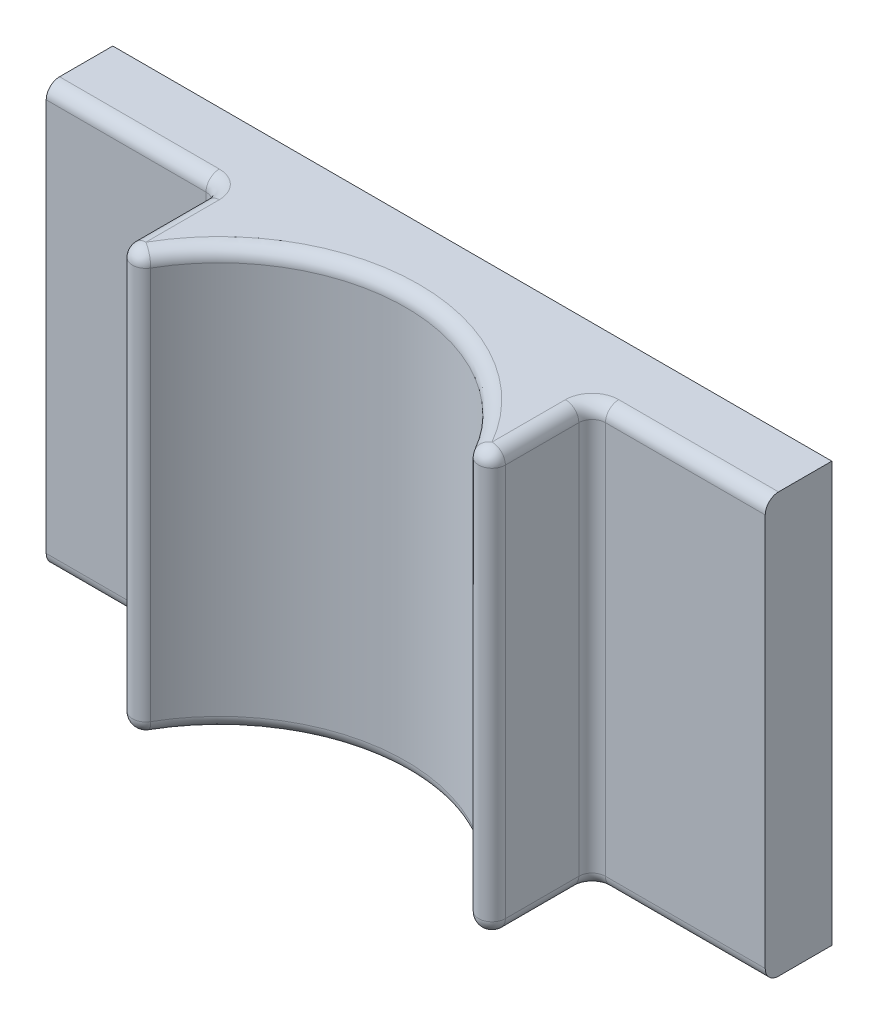
ISO-10303-21;
HEADER;
FILE_DESCRIPTION(('STEP AP214'),'2;1');
FILE_NAME('part.step','',(''),(''),'','','');
FILE_SCHEMA(('AUTOMOTIVE_DESIGN { 1 0 10303 214 1 1 1 1 }'));
ENDSEC;
DATA;
#1=APPLICATION_CONTEXT('core data for automotive mechanical design processes');
#2=APPLICATION_PROTOCOL_DEFINITION('international standard','automotive_design',2000,#1);
#3=PRODUCT_CONTEXT('',#1,'mechanical');
#4=PRODUCT('Part','Part','',(#3));
#5=PRODUCT_RELATED_PRODUCT_CATEGORY('part','',(#4));
#6=PRODUCT_DEFINITION_FORMATION('','',#4);
#7=PRODUCT_DEFINITION_CONTEXT('part definition',#1,'design');
#8=PRODUCT_DEFINITION('design','',#6,#7);
#9=PRODUCT_DEFINITION_SHAPE('','',#8);
#10=(LENGTH_UNIT() NAMED_UNIT(*) SI_UNIT(.MILLI.,.METRE.));
#11=(NAMED_UNIT(*) PLANE_ANGLE_UNIT() SI_UNIT($,.RADIAN.));
#12=(NAMED_UNIT(*) SI_UNIT($,.STERADIAN.) SOLID_ANGLE_UNIT());
#13=UNCERTAINTY_MEASURE_WITH_UNIT(LENGTH_MEASURE(1.E-05),#10,'distance_accuracy_value','');
#14=(GEOMETRIC_REPRESENTATION_CONTEXT(3) GLOBAL_UNCERTAINTY_ASSIGNED_CONTEXT((#13)) GLOBAL_UNIT_ASSIGNED_CONTEXT((#10,
#11,#12)) REPRESENTATION_CONTEXT('',''));
#15=CARTESIAN_POINT('',(0.,0.,0.));
#16=DIRECTION('',(0.,0.,1.));
#17=DIRECTION('',(1.,0.,0.));
#18=AXIS2_PLACEMENT_3D('',#15,#16,#17);
#19=CARTESIAN_POINT('',(0.,31.5,0.));
#20=DIRECTION('',(0.,-1.,0.));
#21=DIRECTION('',(0.,0.,-1.));
#22=AXIS2_PLACEMENT_3D('',#19,#20,#21);
#23=CYLINDRICAL_SURFACE('',#22,14.);
#24=DIRECTION('',(0.,-1.,0.));
#25=VECTOR('',#24,1.);
#26=CARTESIAN_POINT('',(12.1333333333333,31.5,-6.98442712197802));
#27=LINE('',#26,#25);
#28=CARTESIAN_POINT('',(12.1333333333333,1.,-6.98442712197802));
#29=VERTEX_POINT('',#28);
#30=CARTESIAN_POINT('',(12.1333333333333,30.5,-6.98442712197802));
#31=VERTEX_POINT('',#30);
#32=EDGE_CURVE('E274',#29,#31,#27,.F.);
#33=ORIENTED_EDGE('',*,*,#32,.T.);
#34=CARTESIAN_POINT('',(0.,30.5,0.));
#35=DIRECTION('',(0.,1.,0.));
#36=DIRECTION('',(0.,0.,1.));
#37=AXIS2_PLACEMENT_3D('',#34,#35,#36);
#38=CIRCLE('',#37,14.);
#39=CARTESIAN_POINT('',(-12.1333333333333,30.5,-6.98442712197802));
#40=VERTEX_POINT('',#39);
#41=EDGE_CURVE('E276',#31,#40,#38,.T.);
#42=ORIENTED_EDGE('',*,*,#41,.T.);
#43=DIRECTION('',(0.,-1.,0.));
#44=VECTOR('',#43,1.);
#45=CARTESIAN_POINT('',(-12.1333333333333,31.5,-6.98442712197802));
#46=LINE('',#45,#44);
#47=CARTESIAN_POINT('',(-12.1333333333333,1.,-6.98442712197802));
#48=VERTEX_POINT('',#47);
#49=EDGE_CURVE('E270',#40,#48,#46,.T.);
#50=ORIENTED_EDGE('',*,*,#49,.T.);
#51=CARTESIAN_POINT('',(0.,1.,0.));
#52=DIRECTION('',(0.,1.,0.));
#53=DIRECTION('',(0.,0.,1.));
#54=AXIS2_PLACEMENT_3D('',#51,#52,#53);
#55=CIRCLE('',#54,14.);
#56=EDGE_CURVE('E272',#48,#29,#55,.F.);
#57=ORIENTED_EDGE('',*,*,#56,.T.);
#58=EDGE_LOOP('',(#33,#42,#50,#57));
#59=FACE_BOUND('',#58,.T.);
#60=ADVANCED_FACE('F34',(#59),#23,.F.);
#61=CARTESIAN_POINT('',(14.,31.5,0.));
#62=DIRECTION('',(-1.,0.,0.));
#63=DIRECTION('',(0.,0.,1.));
#64=AXIS2_PLACEMENT_3D('',#61,#62,#63);
#65=PLANE('',#64);
#66=DIRECTION('',(0.,-1.,0.));
#67=VECTOR('',#66,1.);
#68=CARTESIAN_POINT('',(14.,31.5,-13.));
#69=LINE('',#68,#67);
#70=CARTESIAN_POINT('',(14.,1.,-13.));
#71=VERTEX_POINT('',#70);
#72=CARTESIAN_POINT('',(14.,30.5,-13.));
#73=VERTEX_POINT('',#72);
#74=EDGE_CURVE('E265',#71,#73,#69,.F.);
#75=ORIENTED_EDGE('',*,*,#74,.T.);
#76=DIRECTION('',(0.,0.,-1.));
#77=VECTOR('',#76,1.);
#78=CARTESIAN_POINT('',(14.,30.5,0.));
#79=LINE('',#78,#77);
#80=CARTESIAN_POINT('',(14.,30.5,-7.48331477354788));
#81=VERTEX_POINT('',#80);
#82=EDGE_CURVE('E267',#73,#81,#79,.F.);
#83=ORIENTED_EDGE('',*,*,#82,.T.);
#84=DIRECTION('',(0.,-1.,0.));
#85=VECTOR('',#84,1.);
#86=CARTESIAN_POINT('',(14.,31.5,-7.48331477354788));
#87=LINE('',#86,#85);
#88=CARTESIAN_POINT('',(14.,1.,-7.48331477354788));
#89=VERTEX_POINT('',#88);
#90=EDGE_CURVE('E261',#81,#89,#87,.T.);
#91=ORIENTED_EDGE('',*,*,#90,.T.);
#92=DIRECTION('',(0.,0.,-1.));
#93=VECTOR('',#92,1.);
#94=CARTESIAN_POINT('',(14.,1.,0.));
#95=LINE('',#94,#93);
#96=EDGE_CURVE('E263',#89,#71,#95,.T.);
#97=ORIENTED_EDGE('',*,*,#96,.T.);
#98=EDGE_LOOP('',(#75,#83,#91,#97));
#99=FACE_BOUND('',#98,.T.);
#100=ADVANCED_FACE('F425',(#99),#65,.F.);
#101=CARTESIAN_POINT('',(14.,31.5,-14.));
#102=DIRECTION('',(0.,0.,-1.));
#103=DIRECTION('',(-1.,0.,0.));
#104=AXIS2_PLACEMENT_3D('',#101,#102,#103);
#105=PLANE('',#104);
#106=DIRECTION('',(0.,-1.,0.));
#107=VECTOR('',#106,1.);
#108=CARTESIAN_POINT('',(27.,31.5,-14.));
#109=LINE('',#108,#107);
#110=CARTESIAN_POINT('',(27.,30.5,-14.));
#111=VERTEX_POINT('',#110);
#112=CARTESIAN_POINT('',(27.,1.,-14.));
#113=VERTEX_POINT('',#112);
#114=EDGE_CURVE('E189',#111,#113,#109,.T.);
#115=ORIENTED_EDGE('',*,*,#114,.F.);
#116=DIRECTION('',(1.,0.,0.));
#117=VECTOR('',#116,1.);
#118=CARTESIAN_POINT('',(14.,30.5,-14.));
#119=LINE('',#118,#117);
#120=CARTESIAN_POINT('',(15.,30.5,-14.));
#121=VERTEX_POINT('',#120);
#122=EDGE_CURVE('E233',#111,#121,#119,.F.);
#123=ORIENTED_EDGE('',*,*,#122,.T.);
#124=DIRECTION('',(0.,-1.,0.));
#125=VECTOR('',#124,1.);
#126=CARTESIAN_POINT('',(15.,0.,-14.));
#127=LINE('',#126,#125);
#128=CARTESIAN_POINT('',(15.,1.,-14.));
#129=VERTEX_POINT('',#128);
#130=EDGE_CURVE('E229',#121,#129,#127,.T.);
#131=ORIENTED_EDGE('',*,*,#130,.T.);
#132=DIRECTION('',(1.,0.,0.));
#133=VECTOR('',#132,1.);
#134=CARTESIAN_POINT('',(14.,1.,-14.));
#135=LINE('',#134,#133);
#136=EDGE_CURVE('E231',#129,#113,#135,.T.);
#137=ORIENTED_EDGE('',*,*,#136,.T.);
#138=EDGE_LOOP('',(#115,#123,#131,#137));
#139=FACE_BOUND('',#138,.T.);
#140=ADVANCED_FACE('F411',(#139),#105,.F.);
#141=CARTESIAN_POINT('',(27.,31.5,-14.));
#142=DIRECTION('',(-1.,0.,0.));
#143=DIRECTION('',(0.,0.,1.));
#144=AXIS2_PLACEMENT_3D('',#141,#142,#143);
#145=PLANE('',#144);
#146=DIRECTION('',(0.,0.,-1.));
#147=VECTOR('',#146,1.);
#148=CARTESIAN_POINT('',(27.,31.5,-14.));
#149=LINE('',#148,#147);
#150=CARTESIAN_POINT('',(27.,31.5,-15.));
#151=VERTEX_POINT('',#150);
#152=CARTESIAN_POINT('',(27.,31.5,-19.));
#153=VERTEX_POINT('',#152);
#154=EDGE_CURVE('E170',#151,#153,#149,.T.);
#155=ORIENTED_EDGE('',*,*,#154,.F.);
#156=CARTESIAN_POINT('',(27.,30.5,-15.));
#157=DIRECTION('',(-1.,0.,0.));
#158=DIRECTION('',(0.,0.,1.));
#159=AXIS2_PLACEMENT_3D('',#156,#157,#158);
#160=CIRCLE('',#159,1.);
#161=EDGE_CURVE('E227',#151,#111,#160,.F.);
#162=ORIENTED_EDGE('',*,*,#161,.T.);
#163=ORIENTED_EDGE('',*,*,#114,.T.);
#164=CARTESIAN_POINT('',(27.,1.,-15.));
#165=DIRECTION('',(-1.,0.,0.));
#166=DIRECTION('',(0.,0.,1.));
#167=AXIS2_PLACEMENT_3D('',#164,#165,#166);
#168=CIRCLE('',#167,1.);
#169=CARTESIAN_POINT('',(27.,0.,-15.));
#170=VERTEX_POINT('',#169);
#171=EDGE_CURVE('E225',#113,#170,#168,.F.);
#172=ORIENTED_EDGE('',*,*,#171,.T.);
#173=DIRECTION('',(0.,0.,-1.));
#174=VECTOR('',#173,1.);
#175=CARTESIAN_POINT('',(27.,0.,-14.));
#176=LINE('',#175,#174);
#177=CARTESIAN_POINT('',(27.,0.,-19.));
#178=VERTEX_POINT('',#177);
#179=EDGE_CURVE('E186',#170,#178,#176,.T.);
#180=ORIENTED_EDGE('',*,*,#179,.T.);
#181=DIRECTION('',(0.,-1.,0.));
#182=VECTOR('',#181,1.);
#183=CARTESIAN_POINT('',(27.,31.5,-19.));
#184=LINE('',#183,#182);
#185=EDGE_CURVE('E183',#153,#178,#184,.T.);
#186=ORIENTED_EDGE('',*,*,#185,.F.);
#187=EDGE_LOOP('',(#155,#162,#163,#172,#180,#186));
#188=FACE_BOUND('',#187,.T.);
#189=ADVANCED_FACE('F184',(#188),#145,.F.);
#190=CARTESIAN_POINT('',(27.,31.5,-19.));
#191=DIRECTION('',(0.,0.,1.));
#192=DIRECTION('',(1.,0.,0.));
#193=AXIS2_PLACEMENT_3D('',#190,#191,#192);
#194=PLANE('',#193);
#195=DIRECTION('',(-1.,0.,0.));
#196=VECTOR('',#195,1.);
#197=CARTESIAN_POINT('',(27.,0.,-19.));
#198=LINE('',#197,#196);
#199=CARTESIAN_POINT('',(-27.,0.,-19.));
#200=VERTEX_POINT('',#199);
#201=EDGE_CURVE('E201',#178,#200,#198,.T.);
#202=ORIENTED_EDGE('',*,*,#201,.T.);
#203=DIRECTION('',(0.,-1.,0.));
#204=VECTOR('',#203,1.);
#205=CARTESIAN_POINT('',(-27.,31.5,-19.));
#206=LINE('',#205,#204);
#207=CARTESIAN_POINT('',(-27.,31.5,-19.));
#208=VERTEX_POINT('',#207);
#209=EDGE_CURVE('E190',#208,#200,#206,.T.);
#210=ORIENTED_EDGE('',*,*,#209,.F.);
#211=DIRECTION('',(-1.,0.,0.));
#212=VECTOR('',#211,1.);
#213=CARTESIAN_POINT('',(27.,31.5,-19.));
#214=LINE('',#213,#212);
#215=EDGE_CURVE('E175',#153,#208,#214,.T.);
#216=ORIENTED_EDGE('',*,*,#215,.F.);
#217=ORIENTED_EDGE('',*,*,#185,.T.);
#218=EDGE_LOOP('',(#202,#210,#216,#217));
#219=FACE_BOUND('',#218,.T.);
#220=ADVANCED_FACE('F192',(#219),#194,.F.);
#221=CARTESIAN_POINT('',(-27.,31.5,-19.));
#222=DIRECTION('',(1.,0.,0.));
#223=DIRECTION('',(0.,0.,-1.));
#224=AXIS2_PLACEMENT_3D('',#221,#222,#223);
#225=PLANE('',#224);
#226=DIRECTION('',(0.,-1.,0.));
#227=VECTOR('',#226,1.);
#228=CARTESIAN_POINT('',(-27.,31.5,-14.));
#229=LINE('',#228,#227);
#230=CARTESIAN_POINT('',(-27.,30.5,-14.));
#231=VERTEX_POINT('',#230);
#232=CARTESIAN_POINT('',(-27.,1.,-14.));
#233=VERTEX_POINT('',#232);
#234=EDGE_CURVE('E197',#231,#233,#229,.T.);
#235=ORIENTED_EDGE('',*,*,#234,.F.);
#236=CARTESIAN_POINT('',(-27.,30.5,-15.));
#237=DIRECTION('',(1.,0.,0.));
#238=DIRECTION('',(0.,0.,-1.));
#239=AXIS2_PLACEMENT_3D('',#236,#237,#238);
#240=CIRCLE('',#239,1.);
#241=CARTESIAN_POINT('',(-27.,31.5,-15.));
#242=VERTEX_POINT('',#241);
#243=EDGE_CURVE('E259',#231,#242,#240,.F.);
#244=ORIENTED_EDGE('',*,*,#243,.T.);
#245=DIRECTION('',(0.,0.,1.));
#246=VECTOR('',#245,1.);
#247=CARTESIAN_POINT('',(-27.,31.5,-19.));
#248=LINE('',#247,#246);
#249=EDGE_CURVE('E195',#208,#242,#248,.T.);
#250=ORIENTED_EDGE('',*,*,#249,.F.);
#251=ORIENTED_EDGE('',*,*,#209,.T.);
#252=DIRECTION('',(0.,0.,1.));
#253=VECTOR('',#252,1.);
#254=CARTESIAN_POINT('',(-27.,0.,-19.));
#255=LINE('',#254,#253);
#256=CARTESIAN_POINT('',(-27.,0.,-15.));
#257=VERTEX_POINT('',#256);
#258=EDGE_CURVE('E180',#200,#257,#255,.T.);
#259=ORIENTED_EDGE('',*,*,#258,.T.);
#260=CARTESIAN_POINT('',(-27.,1.,-15.));
#261=DIRECTION('',(1.,0.,0.));
#262=DIRECTION('',(0.,0.,-1.));
#263=AXIS2_PLACEMENT_3D('',#260,#261,#262);
#264=CIRCLE('',#263,1.);
#265=EDGE_CURVE('E257',#257,#233,#264,.F.);
#266=ORIENTED_EDGE('',*,*,#265,.T.);
#267=EDGE_LOOP('',(#235,#244,#250,#251,#259,#266));
#268=FACE_BOUND('',#267,.T.);
#269=ADVANCED_FACE('F366',(#268),#225,.F.);
#270=CARTESIAN_POINT('',(-27.,31.5,-14.));
#271=DIRECTION('',(0.,0.,-1.));
#272=DIRECTION('',(-1.,0.,0.));
#273=AXIS2_PLACEMENT_3D('',#270,#271,#272);
#274=PLANE('',#273);
#275=DIRECTION('',(0.,-1.,0.));
#276=VECTOR('',#275,1.);
#277=CARTESIAN_POINT('',(-15.,31.5,-14.));
#278=LINE('',#277,#276);
#279=CARTESIAN_POINT('',(-15.,1.,-14.));
#280=VERTEX_POINT('',#279);
#281=CARTESIAN_POINT('',(-15.,30.5,-14.));
#282=VERTEX_POINT('',#281);
#283=EDGE_CURVE('E251',#280,#282,#278,.F.);
#284=ORIENTED_EDGE('',*,*,#283,.T.);
#285=DIRECTION('',(1.,0.,0.));
#286=VECTOR('',#285,1.);
#287=CARTESIAN_POINT('',(-27.,30.5,-14.));
#288=LINE('',#287,#286);
#289=EDGE_CURVE('E255',#282,#231,#288,.F.);
#290=ORIENTED_EDGE('',*,*,#289,.T.);
#291=ORIENTED_EDGE('',*,*,#234,.T.);
#292=DIRECTION('',(1.,0.,0.));
#293=VECTOR('',#292,1.);
#294=CARTESIAN_POINT('',(-27.,1.,-14.));
#295=LINE('',#294,#293);
#296=EDGE_CURVE('E253',#233,#280,#295,.T.);
#297=ORIENTED_EDGE('',*,*,#296,.T.);
#298=EDGE_LOOP('',(#284,#290,#291,#297));
#299=FACE_BOUND('',#298,.T.);
#300=ADVANCED_FACE('F456',(#299),#274,.F.);
#301=CARTESIAN_POINT('',(-14.,31.5,-14.));
#302=DIRECTION('',(1.,0.,0.));
#303=DIRECTION('',(0.,0.,-1.));
#304=AXIS2_PLACEMENT_3D('',#301,#302,#303);
#305=PLANE('',#304);
#306=DIRECTION('',(0.,0.,1.));
#307=VECTOR('',#306,1.);
#308=CARTESIAN_POINT('',(-14.,30.5,-14.));
#309=LINE('',#308,#307);
#310=CARTESIAN_POINT('',(-14.,30.5,-7.48331477354788));
#311=VERTEX_POINT('',#310);
#312=CARTESIAN_POINT('',(-14.,30.5,-13.));
#313=VERTEX_POINT('',#312);
#314=EDGE_CURVE('E43',#311,#313,#309,.F.);
#315=ORIENTED_EDGE('',*,*,#314,.T.);
#316=DIRECTION('',(0.,-1.,0.));
#317=VECTOR('',#316,1.);
#318=CARTESIAN_POINT('',(-14.,0.,-13.));
#319=LINE('',#318,#317);
#320=CARTESIAN_POINT('',(-14.,1.,-13.));
#321=VERTEX_POINT('',#320);
#322=EDGE_CURVE('E11',#313,#321,#319,.T.);
#323=ORIENTED_EDGE('',*,*,#322,.T.);
#324=DIRECTION('',(0.,0.,1.));
#325=VECTOR('',#324,1.);
#326=CARTESIAN_POINT('',(-14.,1.,-14.));
#327=LINE('',#326,#325);
#328=CARTESIAN_POINT('',(-14.,1.,-7.48331477354788));
#329=VERTEX_POINT('',#328);
#330=EDGE_CURVE('E279',#321,#329,#327,.T.);
#331=ORIENTED_EDGE('',*,*,#330,.T.);
#332=DIRECTION('',(0.,-1.,0.));
#333=VECTOR('',#332,1.);
#334=CARTESIAN_POINT('',(-14.,31.5,-7.48331477354788));
#335=LINE('',#334,#333);
#336=EDGE_CURVE('E54',#329,#311,#335,.F.);
#337=ORIENTED_EDGE('',*,*,#336,.T.);
#338=EDGE_LOOP('',(#315,#323,#331,#337));
#339=FACE_BOUND('',#338,.T.);
#340=ADVANCED_FACE('F454',(#339),#305,.F.);
#341=CARTESIAN_POINT('',(0.,31.5,0.));
#342=DIRECTION('',(0.,1.,0.));
#343=DIRECTION('',(0.,0.,1.));
#344=AXIS2_PLACEMENT_3D('',#341,#342,#343);
#345=PLANE('',#344);
#346=CARTESIAN_POINT('',(15.,31.5,-13.));
#347=DIRECTION('',(0.,1.,0.));
#348=DIRECTION('',(0.,0.,1.));
#349=AXIS2_PLACEMENT_3D('',#346,#347,#348);
#350=CIRCLE('',#349,2.);
#351=CARTESIAN_POINT('',(15.,31.5,-15.));
#352=VERTEX_POINT('',#351);
#353=CARTESIAN_POINT('',(13.,31.5,-13.));
#354=VERTEX_POINT('',#353);
#355=EDGE_CURVE('E221',#352,#354,#350,.T.);
#356=ORIENTED_EDGE('',*,*,#355,.F.);
#357=DIRECTION('',(1.,0.,0.));
#358=VECTOR('',#357,1.);
#359=CARTESIAN_POINT('',(27.,31.5,-15.));
#360=LINE('',#359,#358);
#361=EDGE_CURVE('E178',#352,#151,#360,.T.);
#362=ORIENTED_EDGE('',*,*,#361,.T.);
#363=ORIENTED_EDGE('',*,*,#154,.T.);
#364=ORIENTED_EDGE('',*,*,#215,.T.);
#365=ORIENTED_EDGE('',*,*,#249,.T.);
#366=DIRECTION('',(1.,0.,0.));
#367=VECTOR('',#366,1.);
#368=CARTESIAN_POINT('',(-14.,31.5,-15.));
#369=LINE('',#368,#367);
#370=CARTESIAN_POINT('',(-15.,31.5,-15.));
#371=VERTEX_POINT('',#370);
#372=EDGE_CURVE('E219',#242,#371,#369,.T.);
#373=ORIENTED_EDGE('',*,*,#372,.T.);
#374=CARTESIAN_POINT('',(-15.,31.5,-13.));
#375=DIRECTION('',(0.,1.,0.));
#376=DIRECTION('',(0.,0.,1.));
#377=AXIS2_PLACEMENT_3D('',#374,#375,#376);
#378=CIRCLE('',#377,2.);
#379=CARTESIAN_POINT('',(-13.,31.5,-13.));
#380=VERTEX_POINT('',#379);
#381=EDGE_CURVE('E216',#380,#371,#378,.T.);
#382=ORIENTED_EDGE('',*,*,#381,.F.);
#383=DIRECTION('',(0.,0.,1.));
#384=VECTOR('',#383,1.);
#385=CARTESIAN_POINT('',(-13.,31.5,0.));
#386=LINE('',#385,#384);
#387=CARTESIAN_POINT('',(-13.,31.5,-7.48331477354788));
#388=VERTEX_POINT('',#387);
#389=EDGE_CURVE('E210',#380,#388,#386,.T.);
#390=ORIENTED_EDGE('',*,*,#389,.T.);
#391=CARTESIAN_POINT('',(0.,31.5,0.));
#392=DIRECTION('',(0.,1.,0.));
#393=DIRECTION('',(0.,0.,1.));
#394=AXIS2_PLACEMENT_3D('',#391,#392,#393);
#395=CIRCLE('',#394,15.);
#396=CARTESIAN_POINT('',(13.,31.5,-7.48331477354788));
#397=VERTEX_POINT('',#396);
#398=EDGE_CURVE('E212',#388,#397,#395,.F.);
#399=ORIENTED_EDGE('',*,*,#398,.T.);
#400=DIRECTION('',(0.,0.,-1.));
#401=VECTOR('',#400,1.);
#402=CARTESIAN_POINT('',(13.,31.5,-14.));
#403=LINE('',#402,#401);
#404=EDGE_CURVE('E214',#397,#354,#403,.T.);
#405=ORIENTED_EDGE('',*,*,#404,.T.);
#406=EDGE_LOOP('',(#356,#362,#363,#364,#365,#373,#382,#390,#399,#405));
#407=FACE_BOUND('',#406,.T.);
#408=ADVANCED_FACE('F172',(#407),#345,.T.);
#409=CARTESIAN_POINT('',(0.,0.,0.));
#410=DIRECTION('',(0.,1.,0.));
#411=DIRECTION('',(0.,0.,1.));
#412=AXIS2_PLACEMENT_3D('',#409,#410,#411);
#413=PLANE('',#412);
#414=ORIENTED_EDGE('',*,*,#179,.F.);
#415=DIRECTION('',(1.,0.,0.));
#416=VECTOR('',#415,1.);
#417=CARTESIAN_POINT('',(0.,0.,-15.));
#418=LINE('',#417,#416);
#419=CARTESIAN_POINT('',(15.,0.,-15.));
#420=VERTEX_POINT('',#419);
#421=EDGE_CURVE('E249',#170,#420,#418,.F.);
#422=ORIENTED_EDGE('',*,*,#421,.T.);
#423=CARTESIAN_POINT('',(15.,0.,-13.));
#424=DIRECTION('',(0.,1.,0.));
#425=DIRECTION('',(0.,0.,1.));
#426=AXIS2_PLACEMENT_3D('',#423,#424,#425);
#427=CIRCLE('',#426,2.);
#428=CARTESIAN_POINT('',(13.,0.,-13.));
#429=VERTEX_POINT('',#428);
#430=EDGE_CURVE('E246',#429,#420,#427,.F.);
#431=ORIENTED_EDGE('',*,*,#430,.F.);
#432=DIRECTION('',(0.,0.,-1.));
#433=VECTOR('',#432,1.);
#434=CARTESIAN_POINT('',(13.,0.,0.));
#435=LINE('',#434,#433);
#436=CARTESIAN_POINT('',(13.,0.,-7.48331477354788));
#437=VERTEX_POINT('',#436);
#438=EDGE_CURVE('E242',#429,#437,#435,.F.);
#439=ORIENTED_EDGE('',*,*,#438,.T.);
#440=CARTESIAN_POINT('',(0.,0.,0.));
#441=DIRECTION('',(0.,1.,0.));
#442=DIRECTION('',(0.,0.,1.));
#443=AXIS2_PLACEMENT_3D('',#440,#441,#442);
#444=CIRCLE('',#443,15.);
#445=CARTESIAN_POINT('',(-13.,0.,-7.48331477354788));
#446=VERTEX_POINT('',#445);
#447=EDGE_CURVE('E240',#437,#446,#444,.T.);
#448=ORIENTED_EDGE('',*,*,#447,.T.);
#449=DIRECTION('',(0.,0.,1.));
#450=VECTOR('',#449,1.);
#451=CARTESIAN_POINT('',(-13.,0.,0.));
#452=LINE('',#451,#450);
#453=CARTESIAN_POINT('',(-13.,0.,-13.));
#454=VERTEX_POINT('',#453);
#455=EDGE_CURVE('E238',#446,#454,#452,.F.);
#456=ORIENTED_EDGE('',*,*,#455,.T.);
#457=CARTESIAN_POINT('',(-15.,0.,-13.));
#458=DIRECTION('',(0.,1.,0.));
#459=DIRECTION('',(0.,0.,1.));
#460=AXIS2_PLACEMENT_3D('',#457,#458,#459);
#461=CIRCLE('',#460,2.);
#462=CARTESIAN_POINT('',(-15.,0.,-15.));
#463=VERTEX_POINT('',#462);
#464=EDGE_CURVE('E235',#463,#454,#461,.F.);
#465=ORIENTED_EDGE('',*,*,#464,.F.);
#466=DIRECTION('',(1.,0.,0.));
#467=VECTOR('',#466,1.);
#468=CARTESIAN_POINT('',(0.,0.,-15.));
#469=LINE('',#468,#467);
#470=EDGE_CURVE('E244',#463,#257,#469,.F.);
#471=ORIENTED_EDGE('',*,*,#470,.T.);
#472=ORIENTED_EDGE('',*,*,#258,.F.);
#473=ORIENTED_EDGE('',*,*,#201,.F.);
#474=EDGE_LOOP('',(#414,#422,#431,#439,#448,#456,#465,#471,#472,#473));
#475=FACE_BOUND('',#474,.T.);
#476=ADVANCED_FACE('F363',(#475),#413,.F.);
#477=CARTESIAN_POINT('',(-27.,1.,-15.));
#478=DIRECTION('',(1.,0.,0.));
#479=DIRECTION('',(0.,0.,-1.));
#480=AXIS2_PLACEMENT_3D('',#477,#478,#479);
#481=CYLINDRICAL_SURFACE('',#480,1.);
#482=ORIENTED_EDGE('',*,*,#265,.F.);
#483=ORIENTED_EDGE('',*,*,#470,.F.);
#484=CARTESIAN_POINT('',(-15.,1.,-15.));
#485=DIRECTION('',(1.,0.,0.));
#486=DIRECTION('',(0.,0.,-1.));
#487=AXIS2_PLACEMENT_3D('',#484,#485,#486);
#488=CIRCLE('',#487,1.);
#489=EDGE_CURVE('E38',#280,#463,#488,.T.);
#490=ORIENTED_EDGE('',*,*,#489,.F.);
#491=ORIENTED_EDGE('',*,*,#296,.F.);
#492=EDGE_LOOP('',(#482,#483,#490,#491));
#493=FACE_BOUND('',#492,.T.);
#494=ADVANCED_FACE('F36',(#493),#481,.T.);
#495=CARTESIAN_POINT('',(-15.,1.,-13.));
#496=DIRECTION('',(0.,1.,0.));
#497=DIRECTION('',(0.,0.,1.));
#498=AXIS2_PLACEMENT_3D('',#495,#496,#497);
#499=TOROIDAL_SURFACE('',#498,2.,1.);
#500=ORIENTED_EDGE('',*,*,#489,.T.);
#501=ORIENTED_EDGE('',*,*,#464,.T.);
#502=CARTESIAN_POINT('',(-13.,1.,-13.));
#503=DIRECTION('',(0.,0.,-1.));
#504=DIRECTION('',(-1.,0.,0.));
#505=AXIS2_PLACEMENT_3D('',#502,#503,#504);
#506=CIRCLE('',#505,1.);
#507=EDGE_CURVE('E346',#321,#454,#506,.F.);
#508=ORIENTED_EDGE('',*,*,#507,.F.);
#509=CARTESIAN_POINT('',(-15.,1.,-13.));
#510=DIRECTION('',(0.,1.,0.));
#511=DIRECTION('',(0.,0.,1.));
#512=AXIS2_PLACEMENT_3D('',#509,#510,#511);
#513=CIRCLE('',#512,1.);
#514=EDGE_CURVE('E344',#280,#321,#513,.F.);
#515=ORIENTED_EDGE('',*,*,#514,.F.);
#516=EDGE_LOOP('',(#500,#501,#508,#515));
#517=FACE_BOUND('',#516,.T.);
#518=ADVANCED_FACE('F355',(#517),#499,.T.);
#519=CARTESIAN_POINT('',(-13.,1.,-14.));
#520=DIRECTION('',(0.,0.,1.));
#521=DIRECTION('',(1.,0.,0.));
#522=AXIS2_PLACEMENT_3D('',#519,#520,#521);
#523=CYLINDRICAL_SURFACE('',#522,1.);
#524=ORIENTED_EDGE('',*,*,#507,.T.);
#525=ORIENTED_EDGE('',*,*,#455,.F.);
#526=CARTESIAN_POINT('',(-13.,1.,-7.48331477354788));
#527=DIRECTION('',(0.,0.,1.));
#528=DIRECTION('',(0.,-1.,0.));
#529=AXIS2_PLACEMENT_3D('',#526,#527,#528);
#530=CIRCLE('',#529,1.);
#531=EDGE_CURVE('E341',#329,#446,#530,.T.);
#532=ORIENTED_EDGE('',*,*,#531,.F.);
#533=ORIENTED_EDGE('',*,*,#330,.F.);
#534=EDGE_LOOP('',(#524,#525,#532,#533));
#535=FACE_BOUND('',#534,.T.);
#536=ADVANCED_FACE('F451',(#535),#523,.T.);
#537=CARTESIAN_POINT('',(-15.,31.5,-13.));
#538=DIRECTION('',(0.,1.,0.));
#539=DIRECTION('',(0.,0.,1.));
#540=AXIS2_PLACEMENT_3D('',#537,#538,#539);
#541=CYLINDRICAL_SURFACE('',#540,1.);
#542=ORIENTED_EDGE('',*,*,#514,.T.);
#543=ORIENTED_EDGE('',*,*,#322,.F.);
#544=CARTESIAN_POINT('',(-15.,30.5,-13.));
#545=DIRECTION('',(0.,1.,0.));
#546=DIRECTION('',(0.,0.,1.));
#547=AXIS2_PLACEMENT_3D('',#544,#545,#546);
#548=CIRCLE('',#547,1.);
#549=EDGE_CURVE('E338',#282,#313,#548,.F.);
#550=ORIENTED_EDGE('',*,*,#549,.F.);
#551=ORIENTED_EDGE('',*,*,#283,.F.);
#552=EDGE_LOOP('',(#542,#543,#550,#551));
#553=FACE_BOUND('',#552,.T.);
#554=ADVANCED_FACE('F453',(#553),#541,.F.);
#555=CARTESIAN_POINT('',(0.,30.5,-15.));
#556=DIRECTION('',(-1.,0.,0.));
#557=DIRECTION('',(0.,0.,1.));
#558=AXIS2_PLACEMENT_3D('',#555,#556,#557);
#559=CYLINDRICAL_SURFACE('',#558,1.);
#560=ORIENTED_EDGE('',*,*,#243,.F.);
#561=ORIENTED_EDGE('',*,*,#289,.F.);
#562=CARTESIAN_POINT('',(-15.,30.5,-15.));
#563=DIRECTION('',(1.,0.,0.));
#564=DIRECTION('',(0.,0.,-1.));
#565=AXIS2_PLACEMENT_3D('',#562,#563,#564);
#566=CIRCLE('',#565,1.);
#567=EDGE_CURVE('E335',#371,#282,#566,.T.);
#568=ORIENTED_EDGE('',*,*,#567,.F.);
#569=ORIENTED_EDGE('',*,*,#372,.F.);
#570=EDGE_LOOP('',(#560,#561,#568,#569));
#571=FACE_BOUND('',#570,.T.);
#572=ADVANCED_FACE('F371',(#571),#559,.T.);
#573=CARTESIAN_POINT('',(-13.,1.,-7.48331477354788));
#574=DIRECTION('',(0.,0.,1.));
#575=DIRECTION('',(1.,0.,0.));
#576=AXIS2_PLACEMENT_3D('',#573,#574,#575);
#577=SPHERICAL_SURFACE('',#576,1.);
#578=CARTESIAN_POINT('',(-13.,1.,-7.48331477354788));
#579=DIRECTION('',(0.,-1.,0.));
#580=DIRECTION('',(0.,0.,-1.));
#581=AXIS2_PLACEMENT_3D('',#578,#579,#580);
#582=CIRCLE('',#581,1.);
#583=EDGE_CURVE('E329',#329,#48,#582,.F.);
#584=ORIENTED_EDGE('',*,*,#583,.F.);
#585=ORIENTED_EDGE('',*,*,#531,.T.);
#586=CARTESIAN_POINT('',(-13.,1.,-7.48331477354788));
#587=DIRECTION('',(-0.498887651569857,0.,0.866666666666668));
#588=DIRECTION('',(0.866666666666668,0.,0.498887651569857));
#589=AXIS2_PLACEMENT_3D('',#586,#587,#588);
#590=CIRCLE('',#589,1.);
#591=EDGE_CURVE('E332',#48,#446,#590,.F.);
#592=ORIENTED_EDGE('',*,*,#591,.F.);
#593=EDGE_LOOP('',(#584,#585,#592));
#594=FACE_BOUND('',#593,.T.);
#595=ADVANCED_FACE('F449',(#594),#577,.T.);
#596=CARTESIAN_POINT('',(-15.,30.5,-13.));
#597=DIRECTION('',(0.,1.,0.));
#598=DIRECTION('',(0.,0.,1.));
#599=AXIS2_PLACEMENT_3D('',#596,#597,#598);
#600=TOROIDAL_SURFACE('',#599,2.,1.);
#601=ORIENTED_EDGE('',*,*,#567,.T.);
#602=ORIENTED_EDGE('',*,*,#549,.T.);
#603=CARTESIAN_POINT('',(-13.,30.5,-13.));
#604=DIRECTION('',(0.,0.,-1.));
#605=DIRECTION('',(-1.,0.,0.));
#606=AXIS2_PLACEMENT_3D('',#603,#604,#605);
#607=CIRCLE('',#606,1.);
#608=EDGE_CURVE('E326',#380,#313,#607,.F.);
#609=ORIENTED_EDGE('',*,*,#608,.F.);
#610=ORIENTED_EDGE('',*,*,#381,.T.);
#611=EDGE_LOOP('',(#601,#602,#609,#610));
#612=FACE_BOUND('',#611,.T.);
#613=ADVANCED_FACE('F376',(#612),#600,.T.);
#614=CARTESIAN_POINT('',(0.,1.,0.));
#615=DIRECTION('',(0.,1.,0.));
#616=DIRECTION('',(0.,0.,1.));
#617=AXIS2_PLACEMENT_3D('',#614,#615,#616);
#618=TOROIDAL_SURFACE('',#617,15.,1.);
#619=ORIENTED_EDGE('',*,*,#591,.T.);
#620=ORIENTED_EDGE('',*,*,#447,.F.);
#621=CARTESIAN_POINT('',(13.,1.,-7.48331477354788));
#622=DIRECTION('',(0.498887651569859,0.,0.866666666666667));
#623=DIRECTION('',(0.866666666666667,0.,-0.498887651569859));
#624=AXIS2_PLACEMENT_3D('',#621,#622,#623);
#625=CIRCLE('',#624,1.);
#626=EDGE_CURVE('E323',#29,#437,#625,.T.);
#627=ORIENTED_EDGE('',*,*,#626,.F.);
#628=ORIENTED_EDGE('',*,*,#56,.F.);
#629=EDGE_LOOP('',(#619,#620,#627,#628));
#630=FACE_BOUND('',#629,.T.);
#631=ADVANCED_FACE('F435',(#630),#618,.T.);
#632=CARTESIAN_POINT('',(-13.,31.5,-7.48331477354788));
#633=DIRECTION('',(0.,-1.,0.));
#634=DIRECTION('',(0.,0.,-1.));
#635=AXIS2_PLACEMENT_3D('',#632,#633,#634);
#636=CYLINDRICAL_SURFACE('',#635,1.);
#637=ORIENTED_EDGE('',*,*,#583,.T.);
#638=ORIENTED_EDGE('',*,*,#49,.F.);
#639=CARTESIAN_POINT('',(-13.,30.5,-7.48331477354788));
#640=DIRECTION('',(0.,1.,0.));
#641=DIRECTION('',(0.,0.,1.));
#642=AXIS2_PLACEMENT_3D('',#639,#640,#641);
#643=CIRCLE('',#642,1.);
#644=EDGE_CURVE('E320',#311,#40,#643,.T.);
#645=ORIENTED_EDGE('',*,*,#644,.F.);
#646=ORIENTED_EDGE('',*,*,#336,.F.);
#647=EDGE_LOOP('',(#637,#638,#645,#646));
#648=FACE_BOUND('',#647,.T.);
#649=ADVANCED_FACE('F447',(#648),#636,.T.);
#650=CARTESIAN_POINT('',(-13.,30.5,0.));
#651=DIRECTION('',(0.,0.,-1.));
#652=DIRECTION('',(-1.,0.,0.));
#653=AXIS2_PLACEMENT_3D('',#650,#651,#652);
#654=CYLINDRICAL_SURFACE('',#653,1.);
#655=ORIENTED_EDGE('',*,*,#608,.T.);
#656=ORIENTED_EDGE('',*,*,#314,.F.);
#657=CARTESIAN_POINT('',(-13.,30.5,-7.48331477354788));
#658=DIRECTION('',(0.,0.,1.));
#659=DIRECTION('',(1.,0.,0.));
#660=AXIS2_PLACEMENT_3D('',#657,#658,#659);
#661=CIRCLE('',#660,1.);
#662=EDGE_CURVE('E317',#388,#311,#661,.T.);
#663=ORIENTED_EDGE('',*,*,#662,.F.);
#664=ORIENTED_EDGE('',*,*,#389,.F.);
#665=EDGE_LOOP('',(#655,#656,#663,#664));
#666=FACE_BOUND('',#665,.T.);
#667=ADVANCED_FACE('F383',(#666),#654,.T.);
#668=CARTESIAN_POINT('',(13.,1.,-7.48331477354788));
#669=DIRECTION('',(0.,0.,1.));
#670=DIRECTION('',(1.,0.,0.));
#671=AXIS2_PLACEMENT_3D('',#668,#669,#670);
#672=SPHERICAL_SURFACE('',#671,1.);
#673=CARTESIAN_POINT('',(13.,1.,-7.48331477354788));
#674=DIRECTION('',(0.,-1.,0.));
#675=DIRECTION('',(0.,0.,-1.));
#676=AXIS2_PLACEMENT_3D('',#673,#674,#675);
#677=CIRCLE('',#676,1.);
#678=EDGE_CURVE('E311',#29,#89,#677,.F.);
#679=ORIENTED_EDGE('',*,*,#678,.F.);
#680=ORIENTED_EDGE('',*,*,#626,.T.);
#681=CARTESIAN_POINT('',(13.,1.,-7.48331477354788));
#682=DIRECTION('',(0.,0.,1.));
#683=DIRECTION('',(1.,0.,0.));
#684=AXIS2_PLACEMENT_3D('',#681,#682,#683);
#685=CIRCLE('',#684,1.);
#686=EDGE_CURVE('E314',#89,#437,#685,.F.);
#687=ORIENTED_EDGE('',*,*,#686,.F.);
#688=EDGE_LOOP('',(#679,#680,#687));
#689=FACE_BOUND('',#688,.T.);
#690=ADVANCED_FACE('F440',(#689),#672,.T.);
#691=CARTESIAN_POINT('',(-13.,30.5,-7.48331477354788));
#692=DIRECTION('',(0.,0.,1.));
#693=DIRECTION('',(1.,0.,0.));
#694=AXIS2_PLACEMENT_3D('',#691,#692,#693);
#695=SPHERICAL_SURFACE('',#694,1.);
#696=ORIENTED_EDGE('',*,*,#662,.T.);
#697=ORIENTED_EDGE('',*,*,#644,.T.);
#698=CARTESIAN_POINT('',(-13.,30.5,-7.48331477354788));
#699=DIRECTION('',(-0.498887651569859,0.,0.866666666666667));
#700=DIRECTION('',(0.866666666666667,0.,0.498887651569859));
#701=AXIS2_PLACEMENT_3D('',#698,#699,#700);
#702=CIRCLE('',#701,1.);
#703=EDGE_CURVE('E309',#388,#40,#702,.F.);
#704=ORIENTED_EDGE('',*,*,#703,.F.);
#705=EDGE_LOOP('',(#696,#697,#704));
#706=FACE_BOUND('',#705,.T.);
#707=ADVANCED_FACE('F386',(#706),#695,.T.);
#708=CARTESIAN_POINT('',(14.,1.,-15.));
#709=DIRECTION('',(1.,0.,0.));
#710=DIRECTION('',(0.,0.,-1.));
#711=AXIS2_PLACEMENT_3D('',#708,#709,#710);
#712=CYLINDRICAL_SURFACE('',#711,1.);
#713=ORIENTED_EDGE('',*,*,#171,.F.);
#714=ORIENTED_EDGE('',*,*,#136,.F.);
#715=CARTESIAN_POINT('',(15.,1.,-15.));
#716=DIRECTION('',(-1.,0.,0.));
#717=DIRECTION('',(0.,0.,1.));
#718=AXIS2_PLACEMENT_3D('',#715,#716,#717);
#719=CIRCLE('',#718,1.);
#720=EDGE_CURVE('E306',#420,#129,#719,.T.);
#721=ORIENTED_EDGE('',*,*,#720,.F.);
#722=ORIENTED_EDGE('',*,*,#421,.F.);
#723=EDGE_LOOP('',(#713,#714,#721,#722));
#724=FACE_BOUND('',#723,.T.);
#725=ADVANCED_FACE('F416',(#724),#712,.T.);
#726=CARTESIAN_POINT('',(13.,1.,0.));
#727=DIRECTION('',(0.,0.,-1.));
#728=DIRECTION('',(-1.,0.,0.));
#729=AXIS2_PLACEMENT_3D('',#726,#727,#728);
#730=CYLINDRICAL_SURFACE('',#729,1.);
#731=ORIENTED_EDGE('',*,*,#686,.T.);
#732=ORIENTED_EDGE('',*,*,#438,.F.);
#733=CARTESIAN_POINT('',(13.,1.,-13.));
#734=DIRECTION('',(0.,0.,-1.));
#735=DIRECTION('',(-1.,0.,0.));
#736=AXIS2_PLACEMENT_3D('',#733,#734,#735);
#737=CIRCLE('',#736,1.);
#738=EDGE_CURVE('E303',#71,#429,#737,.T.);
#739=ORIENTED_EDGE('',*,*,#738,.F.);
#740=ORIENTED_EDGE('',*,*,#96,.F.);
#741=EDGE_LOOP('',(#731,#732,#739,#740));
#742=FACE_BOUND('',#741,.T.);
#743=ADVANCED_FACE('F430',(#742),#730,.T.);
#744=CARTESIAN_POINT('',(13.,31.5,-7.48331477354788));
#745=DIRECTION('',(0.,-1.,0.));
#746=DIRECTION('',(0.,0.,-1.));
#747=AXIS2_PLACEMENT_3D('',#744,#745,#746);
#748=CYLINDRICAL_SURFACE('',#747,1.);
#749=ORIENTED_EDGE('',*,*,#678,.T.);
#750=ORIENTED_EDGE('',*,*,#90,.F.);
#751=CARTESIAN_POINT('',(13.,30.5,-7.48331477354788));
#752=DIRECTION('',(0.,1.,0.));
#753=DIRECTION('',(0.,0.,1.));
#754=AXIS2_PLACEMENT_3D('',#751,#752,#753);
#755=CIRCLE('',#754,1.);
#756=EDGE_CURVE('E300',#31,#81,#755,.T.);
#757=ORIENTED_EDGE('',*,*,#756,.F.);
#758=ORIENTED_EDGE('',*,*,#32,.F.);
#759=EDGE_LOOP('',(#749,#750,#757,#758));
#760=FACE_BOUND('',#759,.T.);
#761=ADVANCED_FACE('F443',(#760),#748,.T.);
#762=CARTESIAN_POINT('',(0.,30.5,0.));
#763=DIRECTION('',(0.,1.,0.));
#764=DIRECTION('',(0.,0.,1.));
#765=AXIS2_PLACEMENT_3D('',#762,#763,#764);
#766=TOROIDAL_SURFACE('',#765,15.,1.);
#767=ORIENTED_EDGE('',*,*,#703,.T.);
#768=ORIENTED_EDGE('',*,*,#41,.F.);
#769=CARTESIAN_POINT('',(13.,30.5,-7.48331477354788));
#770=DIRECTION('',(0.49888765156986,0.,0.866666666666666));
#771=DIRECTION('',(0.866666666666666,0.,-0.49888765156986));
#772=AXIS2_PLACEMENT_3D('',#769,#770,#771);
#773=CIRCLE('',#772,1.);
#774=EDGE_CURVE('E297',#397,#31,#773,.T.);
#775=ORIENTED_EDGE('',*,*,#774,.F.);
#776=ORIENTED_EDGE('',*,*,#398,.F.);
#777=EDGE_LOOP('',(#767,#768,#775,#776));
#778=FACE_BOUND('',#777,.T.);
#779=ADVANCED_FACE('F390',(#778),#766,.T.);
#780=CARTESIAN_POINT('',(15.,1.,-13.));
#781=DIRECTION('',(0.,1.,0.));
#782=DIRECTION('',(0.,0.,1.));
#783=AXIS2_PLACEMENT_3D('',#780,#781,#782);
#784=TOROIDAL_SURFACE('',#783,2.,1.);
#785=ORIENTED_EDGE('',*,*,#430,.T.);
#786=ORIENTED_EDGE('',*,*,#720,.T.);
#787=CARTESIAN_POINT('',(15.,1.,-13.));
#788=DIRECTION('',(0.,1.,0.));
#789=DIRECTION('',(0.,0.,1.));
#790=AXIS2_PLACEMENT_3D('',#787,#788,#789);
#791=CIRCLE('',#790,1.);
#792=EDGE_CURVE('E294',#71,#129,#791,.F.);
#793=ORIENTED_EDGE('',*,*,#792,.F.);
#794=ORIENTED_EDGE('',*,*,#738,.T.);
#795=EDGE_LOOP('',(#785,#786,#793,#794));
#796=FACE_BOUND('',#795,.T.);
#797=ADVANCED_FACE('F420',(#796),#784,.T.);
#798=CARTESIAN_POINT('',(13.,30.5,-7.48331477354788));
#799=DIRECTION('',(0.,0.,1.));
#800=DIRECTION('',(1.,0.,0.));
#801=AXIS2_PLACEMENT_3D('',#798,#799,#800);
#802=SPHERICAL_SURFACE('',#801,1.);
#803=ORIENTED_EDGE('',*,*,#774,.T.);
#804=ORIENTED_EDGE('',*,*,#756,.T.);
#805=CARTESIAN_POINT('',(13.,30.5,-7.48331477354788));
#806=DIRECTION('',(0.,0.,1.));
#807=DIRECTION('',(0.,-1.,0.));
#808=AXIS2_PLACEMENT_3D('',#805,#806,#807);
#809=CIRCLE('',#808,1.);
#810=EDGE_CURVE('E292',#397,#81,#809,.F.);
#811=ORIENTED_EDGE('',*,*,#810,.F.);
#812=EDGE_LOOP('',(#803,#804,#811));
#813=FACE_BOUND('',#812,.T.);
#814=ADVANCED_FACE('F395',(#813),#802,.T.);
#815=CARTESIAN_POINT('',(15.,31.5,-13.));
#816=DIRECTION('',(0.,1.,0.));
#817=DIRECTION('',(0.,0.,1.));
#818=AXIS2_PLACEMENT_3D('',#815,#816,#817);
#819=CYLINDRICAL_SURFACE('',#818,1.);
#820=ORIENTED_EDGE('',*,*,#792,.T.);
#821=ORIENTED_EDGE('',*,*,#130,.F.);
#822=CARTESIAN_POINT('',(15.,30.5,-13.));
#823=DIRECTION('',(0.,1.,0.));
#824=DIRECTION('',(0.,0.,1.));
#825=AXIS2_PLACEMENT_3D('',#822,#823,#824);
#826=CIRCLE('',#825,1.);
#827=EDGE_CURVE('E289',#73,#121,#826,.F.);
#828=ORIENTED_EDGE('',*,*,#827,.F.);
#829=ORIENTED_EDGE('',*,*,#74,.F.);
#830=EDGE_LOOP('',(#820,#821,#828,#829));
#831=FACE_BOUND('',#830,.T.);
#832=ADVANCED_FACE('F423',(#831),#819,.F.);
#833=CARTESIAN_POINT('',(13.,30.5,0.));
#834=DIRECTION('',(0.,0.,1.));
#835=DIRECTION('',(1.,0.,0.));
#836=AXIS2_PLACEMENT_3D('',#833,#834,#835);
#837=CYLINDRICAL_SURFACE('',#836,1.);
#838=ORIENTED_EDGE('',*,*,#810,.T.);
#839=ORIENTED_EDGE('',*,*,#82,.F.);
#840=CARTESIAN_POINT('',(13.,30.5,-13.));
#841=DIRECTION('',(0.,0.,-1.));
#842=DIRECTION('',(-1.,0.,0.));
#843=AXIS2_PLACEMENT_3D('',#840,#841,#842);
#844=CIRCLE('',#843,1.);
#845=EDGE_CURVE('E286',#354,#73,#844,.T.);
#846=ORIENTED_EDGE('',*,*,#845,.F.);
#847=ORIENTED_EDGE('',*,*,#404,.F.);
#848=EDGE_LOOP('',(#838,#839,#846,#847));
#849=FACE_BOUND('',#848,.T.);
#850=ADVANCED_FACE('F400',(#849),#837,.T.);
#851=CARTESIAN_POINT('',(15.,30.5,-13.));
#852=DIRECTION('',(0.,1.,0.));
#853=DIRECTION('',(0.,0.,1.));
#854=AXIS2_PLACEMENT_3D('',#851,#852,#853);
#855=TOROIDAL_SURFACE('',#854,2.,1.);
#856=ORIENTED_EDGE('',*,*,#845,.T.);
#857=ORIENTED_EDGE('',*,*,#827,.T.);
#858=CARTESIAN_POINT('',(15.,30.5,-15.));
#859=DIRECTION('',(-1.,0.,0.));
#860=DIRECTION('',(0.,0.,1.));
#861=AXIS2_PLACEMENT_3D('',#858,#859,#860);
#862=CIRCLE('',#861,1.);
#863=EDGE_CURVE('E283',#352,#121,#862,.F.);
#864=ORIENTED_EDGE('',*,*,#863,.F.);
#865=ORIENTED_EDGE('',*,*,#355,.T.);
#866=EDGE_LOOP('',(#856,#857,#864,#865));
#867=FACE_BOUND('',#866,.T.);
#868=ADVANCED_FACE('F403',(#867),#855,.T.);
#869=CARTESIAN_POINT('',(0.,30.5,-15.));
#870=DIRECTION('',(-1.,0.,0.));
#871=DIRECTION('',(0.,0.,1.));
#872=AXIS2_PLACEMENT_3D('',#869,#870,#871);
#873=CYLINDRICAL_SURFACE('',#872,1.);
#874=ORIENTED_EDGE('',*,*,#863,.T.);
#875=ORIENTED_EDGE('',*,*,#122,.F.);
#876=ORIENTED_EDGE('',*,*,#161,.F.);
#877=ORIENTED_EDGE('',*,*,#361,.F.);
#878=EDGE_LOOP('',(#874,#875,#876,#877));
#879=FACE_BOUND('',#878,.T.);
#880=ADVANCED_FACE('F407',(#879),#873,.T.);
#881=CLOSED_SHELL('',(#60,#100,#140,#189,#220,#269,#300,#340,#408,#476,#494,#518,#536,#554,#572,
#595,#613,#631,#649,#667,#690,#707,#725,#743,#761,#779,#797,#814,#832,#850,#868,#880));
#882=MANIFOLD_SOLID_BREP('B2',#881);
#883=ADVANCED_BREP_SHAPE_REPRESENTATION('',(#18,#882),#14);
#884=SHAPE_DEFINITION_REPRESENTATION(#9,#883);
ENDSEC;
END-ISO-10303-21;
